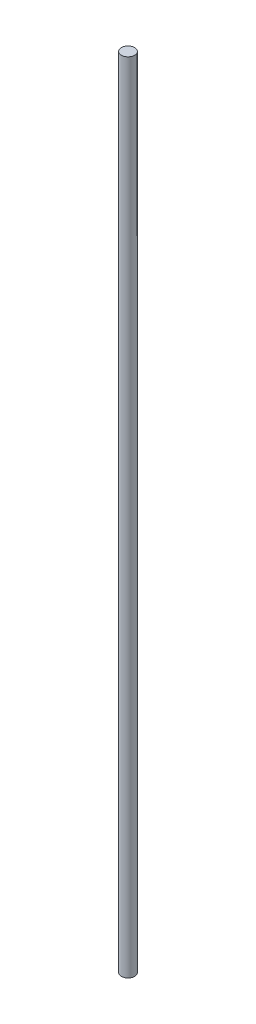
ISO-10303-21;
HEADER;
FILE_DESCRIPTION(('STEP AP214'),'2;1');
FILE_NAME('part.step','',(''),(''),'','','');
FILE_SCHEMA(('AUTOMOTIVE_DESIGN { 1 0 10303 214 1 1 1 1 }'));
ENDSEC;
DATA;
#1=APPLICATION_CONTEXT('core data for automotive mechanical design processes');
#2=APPLICATION_PROTOCOL_DEFINITION('international standard','automotive_design',2000,#1);
#3=PRODUCT_CONTEXT('',#1,'mechanical');
#4=PRODUCT('Part','Part','',(#3));
#5=PRODUCT_RELATED_PRODUCT_CATEGORY('part','',(#4));
#6=PRODUCT_DEFINITION_FORMATION('','',#4);
#7=PRODUCT_DEFINITION_CONTEXT('part definition',#1,'design');
#8=PRODUCT_DEFINITION('design','',#6,#7);
#9=PRODUCT_DEFINITION_SHAPE('','',#8);
#10=(LENGTH_UNIT() NAMED_UNIT(*) SI_UNIT(.MILLI.,.METRE.));
#11=(NAMED_UNIT(*) PLANE_ANGLE_UNIT() SI_UNIT($,.RADIAN.));
#12=(NAMED_UNIT(*) SI_UNIT($,.STERADIAN.) SOLID_ANGLE_UNIT());
#13=UNCERTAINTY_MEASURE_WITH_UNIT(LENGTH_MEASURE(1.E-05),#10,'distance_accuracy_value','');
#14=(GEOMETRIC_REPRESENTATION_CONTEXT(3) GLOBAL_UNCERTAINTY_ASSIGNED_CONTEXT((#13)) GLOBAL_UNIT_ASSIGNED_CONTEXT((#10,
#11,#12)) REPRESENTATION_CONTEXT('',''));
#15=CARTESIAN_POINT('',(0.,0.,0.));
#16=DIRECTION('',(0.,0.,1.));
#17=DIRECTION('',(1.,0.,0.));
#18=AXIS2_PLACEMENT_3D('',#15,#16,#17);
#19=CARTESIAN_POINT('',(0.,90.,0.));
#20=DIRECTION('',(0.,-1.,0.));
#21=DIRECTION('',(0.,0.,-1.));
#22=AXIS2_PLACEMENT_3D('',#19,#20,#21);
#23=CYLINDRICAL_SURFACE('',#22,1.5);
#24=CARTESIAN_POINT('',(0.,90.,0.));
#25=DIRECTION('',(0.,1.,0.));
#26=DIRECTION('',(0.,0.,1.));
#27=AXIS2_PLACEMENT_3D('',#24,#25,#26);
#28=CIRCLE('',#27,1.5);
#29=CARTESIAN_POINT('',(0.,90.,-1.5));
#30=VERTEX_POINT('',#29);
#31=EDGE_CURVE('E10',#30,#30,#28,.T.);
#32=CARTESIAN_POINT('',(0.,-90.,0.));
#33=DIRECTION('',(0.,1.,0.));
#34=DIRECTION('',(0.,0.,1.));
#35=AXIS2_PLACEMENT_3D('',#32,#33,#34);
#36=CIRCLE('',#35,1.5);
#37=CARTESIAN_POINT('',(0.,-90.,-1.5));
#38=VERTEX_POINT('',#37);
#39=EDGE_CURVE('E40',#38,#38,#36,.T.);
#40=CARTESIAN_POINT('',(0.,90.,-1.5));
#41=CARTESIAN_POINT('',(0.,88.125,-1.5));
#42=CARTESIAN_POINT('',(0.,86.25,-1.5));
#43=CARTESIAN_POINT('',(0.,82.5,-1.5));
#44=CARTESIAN_POINT('',(0.,80.625,-1.5));
#45=CARTESIAN_POINT('',(0.,76.875,-1.5));
#46=CARTESIAN_POINT('',(0.,75.,-1.5));
#47=CARTESIAN_POINT('',(0.,71.25,-1.5));
#48=CARTESIAN_POINT('',(0.,69.375,-1.5));
#49=CARTESIAN_POINT('',(0.,65.625,-1.5));
#50=CARTESIAN_POINT('',(0.,63.75,-1.5));
#51=CARTESIAN_POINT('',(0.,60.,-1.5));
#52=CARTESIAN_POINT('',(0.,58.125,-1.5));
#53=CARTESIAN_POINT('',(0.,54.375,-1.5));
#54=CARTESIAN_POINT('',(0.,52.5,-1.5));
#55=CARTESIAN_POINT('',(0.,48.75,-1.5));
#56=CARTESIAN_POINT('',(0.,46.875,-1.5));
#57=CARTESIAN_POINT('',(0.,43.125,-1.5));
#58=CARTESIAN_POINT('',(0.,41.25,-1.5));
#59=CARTESIAN_POINT('',(0.,37.5,-1.5));
#60=CARTESIAN_POINT('',(0.,35.625,-1.5));
#61=CARTESIAN_POINT('',(0.,31.875,-1.5));
#62=CARTESIAN_POINT('',(0.,30.,-1.5));
#63=CARTESIAN_POINT('',(0.,26.25,-1.5));
#64=CARTESIAN_POINT('',(0.,24.375,-1.5));
#65=CARTESIAN_POINT('',(0.,20.625,-1.5));
#66=CARTESIAN_POINT('',(0.,18.75,-1.5));
#67=CARTESIAN_POINT('',(0.,15.,-1.5));
#68=CARTESIAN_POINT('',(0.,13.125,-1.5));
#69=CARTESIAN_POINT('',(0.,9.37499999999998,-1.5));
#70=CARTESIAN_POINT('',(0.,7.49999999999998,-1.5));
#71=CARTESIAN_POINT('',(0.,3.74999999999998,-1.5));
#72=CARTESIAN_POINT('',(0.,1.87499999999997,-1.5));
#73=CARTESIAN_POINT('',(0.,-1.87500000000003,-1.5));
#74=CARTESIAN_POINT('',(0.,-3.75000000000003,-1.5));
#75=CARTESIAN_POINT('',(0.,-7.50000000000003,-1.5));
#76=CARTESIAN_POINT('',(0.,-9.37500000000004,-1.5));
#77=CARTESIAN_POINT('',(0.,-13.125,-1.5));
#78=CARTESIAN_POINT('',(0.,-15.,-1.5));
#79=CARTESIAN_POINT('',(0.,-18.75,-1.5));
#80=CARTESIAN_POINT('',(0.,-20.625,-1.5));
#81=CARTESIAN_POINT('',(0.,-24.375,-1.5));
#82=CARTESIAN_POINT('',(0.,-26.25,-1.5));
#83=CARTESIAN_POINT('',(0.,-30.,-1.5));
#84=CARTESIAN_POINT('',(0.,-31.875,-1.5));
#85=CARTESIAN_POINT('',(0.,-35.625,-1.5));
#86=CARTESIAN_POINT('',(0.,-37.5,-1.5));
#87=CARTESIAN_POINT('',(0.,-41.25,-1.5));
#88=CARTESIAN_POINT('',(0.,-43.125,-1.5));
#89=CARTESIAN_POINT('',(0.,-46.875,-1.5));
#90=CARTESIAN_POINT('',(0.,-48.75,-1.5));
#91=CARTESIAN_POINT('',(0.,-52.5,-1.5));
#92=CARTESIAN_POINT('',(0.,-54.375,-1.5));
#93=CARTESIAN_POINT('',(0.,-58.125,-1.5));
#94=CARTESIAN_POINT('',(0.,-60.,-1.5));
#95=CARTESIAN_POINT('',(0.,-63.75,-1.5));
#96=CARTESIAN_POINT('',(0.,-65.625,-1.5));
#97=CARTESIAN_POINT('',(0.,-69.375,-1.5));
#98=CARTESIAN_POINT('',(0.,-71.25,-1.5));
#99=CARTESIAN_POINT('',(0.,-75.,-1.5));
#100=CARTESIAN_POINT('',(0.,-76.875,-1.5));
#101=CARTESIAN_POINT('',(0.,-80.625,-1.5));
#102=CARTESIAN_POINT('',(0.,-82.5,-1.5));
#103=CARTESIAN_POINT('',(0.,-86.25,-1.5));
#104=CARTESIAN_POINT('',(0.,-88.125,-1.5));
#105=CARTESIAN_POINT('',(0.,-90.,-1.5));
#106=B_SPLINE_CURVE_WITH_KNOTS('',3,(#40,#41,#42,#43,#44,#45,#46,#47,#48,#49,#50,#51,#52,#53,
#54,#55,#56,#57,#58,#59,#60,#61,#62,#63,#64,#65,#66,#67,#68,#69,#70,#71,#72,#73,#74,#75,#76,#77,
#78,#79,#80,#81,#82,#83,#84,#85,#86,#87,#88,#89,#90,#91,#92,#93,#94,#95,#96,#97,#98,#99,#100,
#101,#102,#103,#104,#105),.UNSPECIFIED.,.F.,.F.,(4,2,2,2,2,2,2,2,2,2,2,2,2,2,2,2,2,2,2,2,2,2,2,
2,2,2,2,2,2,2,2,2,4),(0.,5.62499999999999,11.25,16.875,22.5,28.125,33.75,39.375,45.,50.625,
56.25,61.875,67.5,73.125,78.75,84.375,90.,95.625,101.25,106.875,112.5,118.125,123.75,129.375,
135.,140.625,146.25,151.875,157.5,163.125,168.75,174.375,180.),.UNSPECIFIED.);
#107=EDGE_CURVE('BSEAM37',#30,#38,#106,.T.);
#108=ORIENTED_EDGE('',*,*,#31,.F.);
#109=ORIENTED_EDGE('',*,*,#39,.T.);
#110=ORIENTED_EDGE('',*,*,#107,.T.);
#111=ORIENTED_EDGE('',*,*,#107,.F.);
#112=EDGE_LOOP('',(#108,#110,#109,#111));
#113=FACE_BOUND('',#112,.T.);
#114=ADVANCED_FACE('F37',(#113),#23,.T.);
#115=CARTESIAN_POINT('',(0.,90.,0.));
#116=DIRECTION('',(0.,1.,0.));
#117=DIRECTION('',(0.,0.,1.));
#118=AXIS2_PLACEMENT_3D('',#115,#116,#117);
#119=PLANE('',#118);
#120=ORIENTED_EDGE('',*,*,#31,.T.);
#121=EDGE_LOOP('',(#120));
#122=FACE_BOUND('',#121,.T.);
#123=ADVANCED_FACE('F54',(#122),#119,.T.);
#124=CARTESIAN_POINT('',(0.,-90.,0.));
#125=DIRECTION('',(0.,1.,0.));
#126=DIRECTION('',(0.,0.,1.));
#127=AXIS2_PLACEMENT_3D('',#124,#125,#126);
#128=PLANE('',#127);
#129=ORIENTED_EDGE('',*,*,#39,.F.);
#130=EDGE_LOOP('',(#129));
#131=FACE_BOUND('',#130,.T.);
#132=ADVANCED_FACE('F52',(#131),#128,.F.);
#133=CLOSED_SHELL('',(#114,#123,#132));
#134=MANIFOLD_SOLID_BREP('B2',#133);
#135=ADVANCED_BREP_SHAPE_REPRESENTATION('',(#18,#134),#14);
#136=SHAPE_DEFINITION_REPRESENTATION(#9,#135);
ENDSEC;
END-ISO-10303-21;
